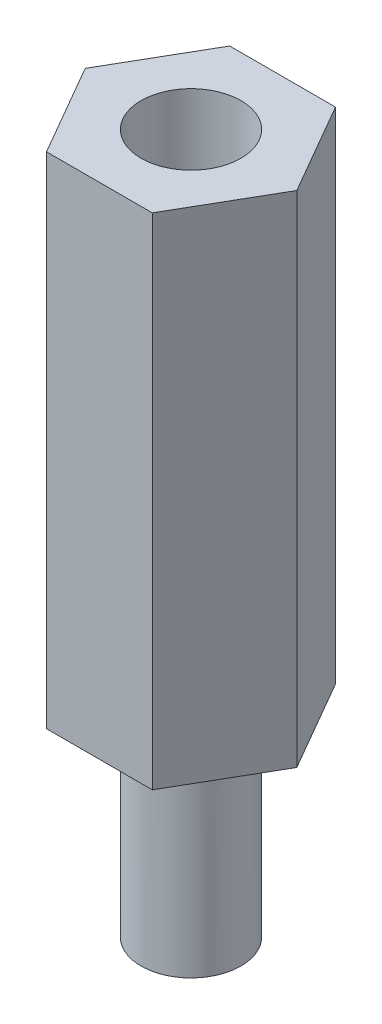
ISO-10303-21;
HEADER;
FILE_DESCRIPTION(('STEP AP214'),'2;1');
FILE_NAME('part.step','',(''),(''),'','','');
FILE_SCHEMA(('AUTOMOTIVE_DESIGN { 1 0 10303 214 1 1 1 1 }'));
ENDSEC;
DATA;
#1=APPLICATION_CONTEXT('core data for automotive mechanical design processes');
#2=APPLICATION_PROTOCOL_DEFINITION('international standard','automotive_design',2000,#1);
#3=PRODUCT_CONTEXT('',#1,'mechanical');
#4=PRODUCT('Part','Part','',(#3));
#5=PRODUCT_RELATED_PRODUCT_CATEGORY('part','',(#4));
#6=PRODUCT_DEFINITION_FORMATION('','',#4);
#7=PRODUCT_DEFINITION_CONTEXT('part definition',#1,'design');
#8=PRODUCT_DEFINITION('design','',#6,#7);
#9=PRODUCT_DEFINITION_SHAPE('','',#8);
#10=(LENGTH_UNIT() NAMED_UNIT(*) SI_UNIT(.MILLI.,.METRE.));
#11=(NAMED_UNIT(*) PLANE_ANGLE_UNIT() SI_UNIT($,.RADIAN.));
#12=(NAMED_UNIT(*) SI_UNIT($,.STERADIAN.) SOLID_ANGLE_UNIT());
#13=UNCERTAINTY_MEASURE_WITH_UNIT(LENGTH_MEASURE(1.E-05),#10,'distance_accuracy_value','');
#14=(GEOMETRIC_REPRESENTATION_CONTEXT(3) GLOBAL_UNCERTAINTY_ASSIGNED_CONTEXT((#13)) GLOBAL_UNIT_ASSIGNED_CONTEXT((#10,
#11,#12)) REPRESENTATION_CONTEXT('',''));
#15=CARTESIAN_POINT('',(0.,0.,0.));
#16=DIRECTION('',(0.,0.,1.));
#17=DIRECTION('',(1.,0.,0.));
#18=AXIS2_PLACEMENT_3D('',#15,#16,#17);
#19=CARTESIAN_POINT('',(0.,15.,0.));
#20=DIRECTION('',(0.,-1.,0.));
#21=DIRECTION('',(0.,0.,-1.));
#22=AXIS2_PLACEMENT_3D('',#19,#20,#21);
#23=CYLINDRICAL_SURFACE('',#22,1.5);
#24=CARTESIAN_POINT('',(0.,15.,0.));
#25=DIRECTION('',(0.,1.,0.));
#26=DIRECTION('',(0.,0.,1.));
#27=AXIS2_PLACEMENT_3D('',#24,#25,#26);
#28=CIRCLE('',#27,1.5);
#29=CARTESIAN_POINT('',(0.,15.,1.5));
#30=VERTEX_POINT('',#29);
#31=EDGE_CURVE('E122',#30,#30,#28,.T.);
#32=ORIENTED_EDGE('',*,*,#31,.T.);
#33=EDGE_LOOP('',(#32));
#34=FACE_BOUND('',#33,.T.);
#35=CARTESIAN_POINT('',(0.,1.,0.));
#36=DIRECTION('',(0.,-1.,0.));
#37=DIRECTION('',(0.,0.,-1.));
#38=AXIS2_PLACEMENT_3D('',#35,#36,#37);
#39=CIRCLE('',#38,1.5);
#40=CARTESIAN_POINT('',(0.,1.,-1.5));
#41=VERTEX_POINT('',#40);
#42=EDGE_CURVE('E227',#41,#41,#39,.T.);
#43=ORIENTED_EDGE('',*,*,#42,.T.);
#44=EDGE_LOOP('',(#43));
#45=FACE_BOUND('',#44,.T.);
#46=ADVANCED_FACE('F32',(#34,#45),#23,.F.);
#47=CARTESIAN_POINT('',(0.,15.,0.));
#48=DIRECTION('',(0.,1.,0.));
#49=DIRECTION('',(0.,0.,1.));
#50=AXIS2_PLACEMENT_3D('',#47,#48,#49);
#51=PLANE('',#50);
#52=DIRECTION('',(-0.5,0.,-0.866025403784438));
#53=VECTOR('',#52,1.);
#54=CARTESIAN_POINT('',(3.17542648054294,15.,0.));
#55=LINE('',#54,#53);
#56=CARTESIAN_POINT('',(3.17542648054294,15.,0.));
#57=VERTEX_POINT('',#56);
#58=CARTESIAN_POINT('',(1.58771324027147,15.,-2.75));
#59=VERTEX_POINT('',#58);
#60=EDGE_CURVE('E129',#57,#59,#55,.T.);
#61=ORIENTED_EDGE('',*,*,#60,.T.);
#62=DIRECTION('',(-1.,0.,0.));
#63=VECTOR('',#62,1.);
#64=CARTESIAN_POINT('',(1.58771324027147,15.,-2.75));
#65=LINE('',#64,#63);
#66=CARTESIAN_POINT('',(-1.58771324027147,15.,-2.75));
#67=VERTEX_POINT('',#66);
#68=EDGE_CURVE('E86',#59,#67,#65,.T.);
#69=ORIENTED_EDGE('',*,*,#68,.T.);
#70=DIRECTION('',(-0.5,0.,0.866025403784439));
#71=VECTOR('',#70,1.);
#72=CARTESIAN_POINT('',(-1.58771324027147,15.,-2.75));
#73=LINE('',#72,#71);
#74=CARTESIAN_POINT('',(-3.17542648054294,15.,0.));
#75=VERTEX_POINT('',#74);
#76=EDGE_CURVE('E100',#67,#75,#73,.T.);
#77=ORIENTED_EDGE('',*,*,#76,.T.);
#78=DIRECTION('',(0.5,0.,0.866025403784439));
#79=VECTOR('',#78,1.);
#80=CARTESIAN_POINT('',(-3.17542648054294,15.,0.));
#81=LINE('',#80,#79);
#82=CARTESIAN_POINT('',(-1.58771324027147,15.,2.75));
#83=VERTEX_POINT('',#82);
#84=EDGE_CURVE('E93',#75,#83,#81,.T.);
#85=ORIENTED_EDGE('',*,*,#84,.T.);
#86=DIRECTION('',(1.,0.,0.));
#87=VECTOR('',#86,1.);
#88=CARTESIAN_POINT('',(-1.58771324027147,15.,2.75));
#89=LINE('',#88,#87);
#90=CARTESIAN_POINT('',(1.58771324027147,15.,2.75));
#91=VERTEX_POINT('',#90);
#92=EDGE_CURVE('E98',#83,#91,#89,.T.);
#93=ORIENTED_EDGE('',*,*,#92,.T.);
#94=DIRECTION('',(0.5,0.,-0.866025403784439));
#95=VECTOR('',#94,1.);
#96=CARTESIAN_POINT('',(1.58771324027147,15.,2.75));
#97=LINE('',#96,#95);
#98=EDGE_CURVE('E49',#91,#57,#97,.T.);
#99=ORIENTED_EDGE('',*,*,#98,.T.);
#100=EDGE_LOOP('',(#61,#69,#77,#85,#93,#99));
#101=FACE_BOUND('',#100,.T.);
#102=ORIENTED_EDGE('',*,*,#31,.F.);
#103=EDGE_LOOP('',(#102));
#104=FACE_BOUND('',#103,.T.);
#105=ADVANCED_FACE('F95',(#101,#104),#51,.T.);
#106=CARTESIAN_POINT('',(0.,0.,0.));
#107=DIRECTION('',(0.,1.,0.));
#108=DIRECTION('',(0.,0.,1.));
#109=AXIS2_PLACEMENT_3D('',#106,#107,#108);
#110=PLANE('',#109);
#111=DIRECTION('',(-0.5,0.,-0.866025403784438));
#112=VECTOR('',#111,1.);
#113=CARTESIAN_POINT('',(3.17542648054294,0.,0.));
#114=LINE('',#113,#112);
#115=CARTESIAN_POINT('',(3.17542648054294,0.,0.));
#116=VERTEX_POINT('',#115);
#117=CARTESIAN_POINT('',(1.58771324027147,0.,-2.75));
#118=VERTEX_POINT('',#117);
#119=EDGE_CURVE('E118',#116,#118,#114,.T.);
#120=ORIENTED_EDGE('',*,*,#119,.F.);
#121=DIRECTION('',(0.5,0.,-0.866025403784439));
#122=VECTOR('',#121,1.);
#123=CARTESIAN_POINT('',(1.58771324027147,0.,2.75));
#124=LINE('',#123,#122);
#125=CARTESIAN_POINT('',(1.58771324027147,0.,2.75));
#126=VERTEX_POINT('',#125);
#127=EDGE_CURVE('E78',#126,#116,#124,.T.);
#128=ORIENTED_EDGE('',*,*,#127,.F.);
#129=DIRECTION('',(1.,0.,0.));
#130=VECTOR('',#129,1.);
#131=CARTESIAN_POINT('',(-1.58771324027147,0.,2.75));
#132=LINE('',#131,#130);
#133=CARTESIAN_POINT('',(-1.58771324027147,0.,2.75));
#134=VERTEX_POINT('',#133);
#135=EDGE_CURVE('E72',#134,#126,#132,.T.);
#136=ORIENTED_EDGE('',*,*,#135,.F.);
#137=DIRECTION('',(0.5,0.,0.866025403784439));
#138=VECTOR('',#137,1.);
#139=CARTESIAN_POINT('',(-3.17542648054294,0.,0.));
#140=LINE('',#139,#138);
#141=CARTESIAN_POINT('',(-3.17542648054294,0.,0.));
#142=VERTEX_POINT('',#141);
#143=EDGE_CURVE('E108',#142,#134,#140,.T.);
#144=ORIENTED_EDGE('',*,*,#143,.F.);
#145=DIRECTION('',(-0.5,0.,0.866025403784439));
#146=VECTOR('',#145,1.);
#147=CARTESIAN_POINT('',(-1.58771324027147,0.,-2.75));
#148=LINE('',#147,#146);
#149=CARTESIAN_POINT('',(-1.58771324027147,0.,-2.75));
#150=VERTEX_POINT('',#149);
#151=EDGE_CURVE('E124',#150,#142,#148,.T.);
#152=ORIENTED_EDGE('',*,*,#151,.F.);
#153=DIRECTION('',(-1.,0.,0.));
#154=VECTOR('',#153,1.);
#155=CARTESIAN_POINT('',(1.58771324027147,0.,-2.75));
#156=LINE('',#155,#154);
#157=EDGE_CURVE('E121',#118,#150,#156,.T.);
#158=ORIENTED_EDGE('',*,*,#157,.F.);
#159=EDGE_LOOP('',(#120,#128,#136,#144,#152,#158));
#160=FACE_BOUND('',#159,.T.);
#161=CARTESIAN_POINT('',(0.,0.,0.));
#162=DIRECTION('',(0.,1.,0.));
#163=DIRECTION('',(0.,0.,1.));
#164=AXIS2_PLACEMENT_3D('',#161,#162,#163);
#165=CIRCLE('',#164,1.5);
#166=CARTESIAN_POINT('',(0.,0.,1.5));
#167=VERTEX_POINT('',#166);
#168=EDGE_CURVE('E230',#167,#167,#165,.T.);
#169=ORIENTED_EDGE('',*,*,#168,.T.);
#170=EDGE_LOOP('',(#169));
#171=FACE_BOUND('',#170,.T.);
#172=ADVANCED_FACE('F138',(#160,#171),#110,.F.);
#173=CARTESIAN_POINT('',(3.17542648054294,15.,0.));
#174=DIRECTION('',(-0.866025403784439,0.,0.5));
#175=DIRECTION('',(0.5,0.,0.866025403784439));
#176=AXIS2_PLACEMENT_3D('',#173,#174,#175);
#177=PLANE('',#176);
#178=ORIENTED_EDGE('',*,*,#119,.T.);
#179=DIRECTION('',(0.,-1.,0.));
#180=VECTOR('',#179,1.);
#181=CARTESIAN_POINT('',(1.58771324027147,15.,-2.75));
#182=LINE('',#181,#180);
#183=EDGE_CURVE('E11',#59,#118,#182,.T.);
#184=ORIENTED_EDGE('',*,*,#183,.F.);
#185=ORIENTED_EDGE('',*,*,#60,.F.);
#186=DIRECTION('',(0.,-1.,0.));
#187=VECTOR('',#186,1.);
#188=CARTESIAN_POINT('',(3.17542648054294,15.,0.));
#189=LINE('',#188,#187);
#190=EDGE_CURVE('E114',#57,#116,#189,.T.);
#191=ORIENTED_EDGE('',*,*,#190,.T.);
#192=EDGE_LOOP('',(#178,#184,#185,#191));
#193=FACE_BOUND('',#192,.T.);
#194=ADVANCED_FACE('F34',(#193),#177,.F.);
#195=CARTESIAN_POINT('',(1.58771324027147,15.,-2.75));
#196=DIRECTION('',(0.,0.,1.));
#197=DIRECTION('',(1.,0.,0.));
#198=AXIS2_PLACEMENT_3D('',#195,#196,#197);
#199=PLANE('',#198);
#200=ORIENTED_EDGE('',*,*,#157,.T.);
#201=DIRECTION('',(0.,-1.,0.));
#202=VECTOR('',#201,1.);
#203=CARTESIAN_POINT('',(-1.58771324027147,15.,-2.75));
#204=LINE('',#203,#202);
#205=EDGE_CURVE('E41',#67,#150,#204,.T.);
#206=ORIENTED_EDGE('',*,*,#205,.F.);
#207=ORIENTED_EDGE('',*,*,#68,.F.);
#208=ORIENTED_EDGE('',*,*,#183,.T.);
#209=EDGE_LOOP('',(#200,#206,#207,#208));
#210=FACE_BOUND('',#209,.T.);
#211=ADVANCED_FACE('F170',(#210),#199,.F.);
#212=CARTESIAN_POINT('',(-1.58771324027147,15.,-2.75));
#213=DIRECTION('',(0.866025403784439,0.,0.5));
#214=DIRECTION('',(0.5,0.,-0.866025403784439));
#215=AXIS2_PLACEMENT_3D('',#212,#213,#214);
#216=PLANE('',#215);
#217=ORIENTED_EDGE('',*,*,#151,.T.);
#218=DIRECTION('',(0.,-1.,0.));
#219=VECTOR('',#218,1.);
#220=CARTESIAN_POINT('',(-3.17542648054294,15.,0.));
#221=LINE('',#220,#219);
#222=EDGE_CURVE('E109',#75,#142,#221,.T.);
#223=ORIENTED_EDGE('',*,*,#222,.F.);
#224=ORIENTED_EDGE('',*,*,#76,.F.);
#225=ORIENTED_EDGE('',*,*,#205,.T.);
#226=EDGE_LOOP('',(#217,#223,#224,#225));
#227=FACE_BOUND('',#226,.T.);
#228=ADVANCED_FACE('F135',(#227),#216,.F.);
#229=CARTESIAN_POINT('',(-3.17542648054294,15.,0.));
#230=DIRECTION('',(0.866025403784439,0.,-0.5));
#231=DIRECTION('',(-0.5,0.,-0.866025403784439));
#232=AXIS2_PLACEMENT_3D('',#229,#230,#231);
#233=PLANE('',#232);
#234=ORIENTED_EDGE('',*,*,#143,.T.);
#235=DIRECTION('',(0.,-1.,0.));
#236=VECTOR('',#235,1.);
#237=CARTESIAN_POINT('',(-1.58771324027147,15.,2.75));
#238=LINE('',#237,#236);
#239=EDGE_CURVE('E105',#83,#134,#238,.T.);
#240=ORIENTED_EDGE('',*,*,#239,.F.);
#241=ORIENTED_EDGE('',*,*,#84,.F.);
#242=ORIENTED_EDGE('',*,*,#222,.T.);
#243=EDGE_LOOP('',(#234,#240,#241,#242));
#244=FACE_BOUND('',#243,.T.);
#245=ADVANCED_FACE('F106',(#244),#233,.F.);
#246=CARTESIAN_POINT('',(-1.58771324027147,15.,2.75));
#247=DIRECTION('',(0.,0.,-1.));
#248=DIRECTION('',(-1.,0.,0.));
#249=AXIS2_PLACEMENT_3D('',#246,#247,#248);
#250=PLANE('',#249);
#251=ORIENTED_EDGE('',*,*,#135,.T.);
#252=DIRECTION('',(0.,-1.,0.));
#253=VECTOR('',#252,1.);
#254=CARTESIAN_POINT('',(1.58771324027147,15.,2.75));
#255=LINE('',#254,#253);
#256=EDGE_CURVE('E110',#91,#126,#255,.T.);
#257=ORIENTED_EDGE('',*,*,#256,.F.);
#258=ORIENTED_EDGE('',*,*,#92,.F.);
#259=ORIENTED_EDGE('',*,*,#239,.T.);
#260=EDGE_LOOP('',(#251,#257,#258,#259));
#261=FACE_BOUND('',#260,.T.);
#262=ADVANCED_FACE('F112',(#261),#250,.F.);
#263=CARTESIAN_POINT('',(1.58771324027147,15.,2.75));
#264=DIRECTION('',(-0.866025403784439,0.,-0.5));
#265=DIRECTION('',(-0.5,0.,0.866025403784439));
#266=AXIS2_PLACEMENT_3D('',#263,#264,#265);
#267=PLANE('',#266);
#268=ORIENTED_EDGE('',*,*,#127,.T.);
#269=ORIENTED_EDGE('',*,*,#190,.F.);
#270=ORIENTED_EDGE('',*,*,#98,.F.);
#271=ORIENTED_EDGE('',*,*,#256,.T.);
#272=EDGE_LOOP('',(#268,#269,#270,#271));
#273=FACE_BOUND('',#272,.T.);
#274=ADVANCED_FACE('F143',(#273),#267,.F.);
#275=CARTESIAN_POINT('',(0.,1.,0.));
#276=DIRECTION('',(0.,-1.,0.));
#277=DIRECTION('',(0.,0.,-1.));
#278=AXIS2_PLACEMENT_3D('',#275,#276,#277);
#279=PLANE('',#278);
#280=ORIENTED_EDGE('',*,*,#42,.F.);
#281=EDGE_LOOP('',(#280));
#282=FACE_BOUND('',#281,.T.);
#283=ADVANCED_FACE('F145',(#282),#279,.F.);
#284=CARTESIAN_POINT('',(0.,1.,0.));
#285=DIRECTION('',(0.,-1.,0.));
#286=DIRECTION('',(0.,0.,-1.));
#287=AXIS2_PLACEMENT_3D('',#284,#285,#286);
#288=CYLINDRICAL_SURFACE('',#287,1.5);
#289=CARTESIAN_POINT('',(0.,-6.,0.));
#290=DIRECTION('',(0.,-1.,0.));
#291=DIRECTION('',(0.,0.,-1.));
#292=AXIS2_PLACEMENT_3D('',#289,#290,#291);
#293=CIRCLE('',#292,1.5);
#294=CARTESIAN_POINT('',(0.,-6.,-1.5));
#295=VERTEX_POINT('',#294);
#296=EDGE_CURVE('E226',#295,#295,#293,.T.);
#297=ORIENTED_EDGE('',*,*,#296,.F.);
#298=EDGE_LOOP('',(#297));
#299=FACE_BOUND('',#298,.T.);
#300=ORIENTED_EDGE('',*,*,#168,.F.);
#301=EDGE_LOOP('',(#300));
#302=FACE_BOUND('',#301,.T.);
#303=ADVANCED_FACE('F151',(#299,#302),#288,.T.);
#304=CARTESIAN_POINT('',(0.,-6.,0.));
#305=DIRECTION('',(0.,-1.,0.));
#306=DIRECTION('',(0.,0.,-1.));
#307=AXIS2_PLACEMENT_3D('',#304,#305,#306);
#308=PLANE('',#307);
#309=ORIENTED_EDGE('',*,*,#296,.T.);
#310=EDGE_LOOP('',(#309));
#311=FACE_BOUND('',#310,.T.);
#312=ADVANCED_FACE('F211',(#311),#308,.T.);
#313=CLOSED_SHELL('',(#46,#105,#172,#194,#211,#228,#245,#262,#274,#283,#303,#312));
#314=MANIFOLD_SOLID_BREP('B2',#313);
#315=ADVANCED_BREP_SHAPE_REPRESENTATION('',(#18,#314),#14);
#316=SHAPE_DEFINITION_REPRESENTATION(#9,#315);
ENDSEC;
END-ISO-10303-21;
